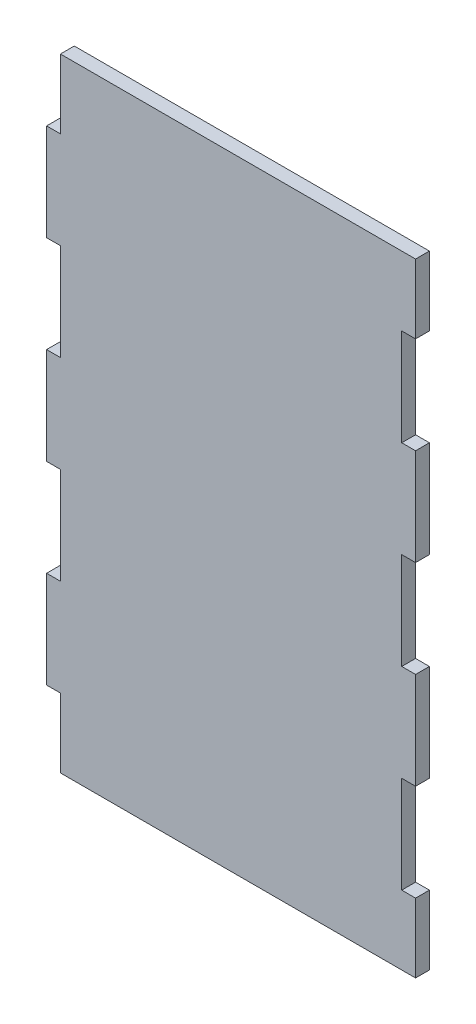
ISO-10303-21;
HEADER;
FILE_DESCRIPTION(('STEP AP214'),'2;1');
FILE_NAME('part.step','',(''),(''),'','','');
FILE_SCHEMA(('AUTOMOTIVE_DESIGN { 1 0 10303 214 1 1 1 1 }'));
ENDSEC;
DATA;
#1=APPLICATION_CONTEXT('core data for automotive mechanical design processes');
#2=APPLICATION_PROTOCOL_DEFINITION('international standard','automotive_design',2000,#1);
#3=PRODUCT_CONTEXT('',#1,'mechanical');
#4=PRODUCT('Part','Part','',(#3));
#5=PRODUCT_RELATED_PRODUCT_CATEGORY('part','',(#4));
#6=PRODUCT_DEFINITION_FORMATION('','',#4);
#7=PRODUCT_DEFINITION_CONTEXT('part definition',#1,'design');
#8=PRODUCT_DEFINITION('design','',#6,#7);
#9=PRODUCT_DEFINITION_SHAPE('','',#8);
#10=(LENGTH_UNIT() NAMED_UNIT(*) SI_UNIT(.MILLI.,.METRE.));
#11=(NAMED_UNIT(*) PLANE_ANGLE_UNIT() SI_UNIT($,.RADIAN.));
#12=(NAMED_UNIT(*) SI_UNIT($,.STERADIAN.) SOLID_ANGLE_UNIT());
#13=UNCERTAINTY_MEASURE_WITH_UNIT(LENGTH_MEASURE(1.E-05),#10,'distance_accuracy_value','');
#14=(GEOMETRIC_REPRESENTATION_CONTEXT(3) GLOBAL_UNCERTAINTY_ASSIGNED_CONTEXT((#13)) GLOBAL_UNIT_ASSIGNED_CONTEXT((#10,
#11,#12)) REPRESENTATION_CONTEXT('',''));
#15=CARTESIAN_POINT('',(0.,0.,0.));
#16=DIRECTION('',(0.,0.,1.));
#17=DIRECTION('',(1.,0.,0.));
#18=AXIS2_PLACEMENT_3D('',#15,#16,#17);
#19=CARTESIAN_POINT('',(-38.5,-67.5,3.));
#20=DIRECTION('',(1.,0.,0.));
#21=DIRECTION('',(0.,0.,-1.));
#22=AXIS2_PLACEMENT_3D('',#19,#20,#21);
#23=PLANE('',#22);
#24=DIRECTION('',(0.,-1.,0.));
#25=VECTOR('',#24,1.);
#26=CARTESIAN_POINT('',(-38.5,-67.5,3.));
#27=LINE('',#26,#25);
#28=CARTESIAN_POINT('',(-38.5,-52.5,3.));
#29=VERTEX_POINT('',#28);
#30=CARTESIAN_POINT('',(-38.5,-67.5,3.));
#31=VERTEX_POINT('',#30);
#32=EDGE_CURVE('E53',#29,#31,#27,.T.);
#33=ORIENTED_EDGE('',*,*,#32,.F.);
#34=DIRECTION('',(0.,0.,1.));
#35=VECTOR('',#34,1.);
#36=CARTESIAN_POINT('',(-38.5,-52.5,0.));
#37=LINE('',#36,#35);
#38=CARTESIAN_POINT('',(-38.5,-52.5,0.));
#39=VERTEX_POINT('',#38);
#40=EDGE_CURVE('E255',#39,#29,#37,.T.);
#41=ORIENTED_EDGE('',*,*,#40,.F.);
#42=DIRECTION('',(0.,-1.,0.));
#43=VECTOR('',#42,1.);
#44=CARTESIAN_POINT('',(-38.5,-67.5,0.));
#45=LINE('',#44,#43);
#46=CARTESIAN_POINT('',(-38.5,-67.5,0.));
#47=VERTEX_POINT('',#46);
#48=EDGE_CURVE('E334',#39,#47,#45,.T.);
#49=ORIENTED_EDGE('',*,*,#48,.T.);
#50=DIRECTION('',(0.,0.,-1.));
#51=VECTOR('',#50,1.);
#52=CARTESIAN_POINT('',(-38.5,-67.5,3.));
#53=LINE('',#52,#51);
#54=EDGE_CURVE('E11',#31,#47,#53,.T.);
#55=ORIENTED_EDGE('',*,*,#54,.F.);
#56=EDGE_LOOP('',(#33,#41,#49,#55));
#57=FACE_BOUND('',#56,.T.);
#58=ADVANCED_FACE('F38',(#57),#23,.F.);
#59=CARTESIAN_POINT('',(-38.5,-10.5,0.));
#60=VERTEX_POINT('',#59);
#61=CARTESIAN_POINT('',(-38.5,-31.5,0.));
#62=VERTEX_POINT('',#61);
#63=EDGE_CURVE('E443',#60,#62,#45,.T.);
#64=ORIENTED_EDGE('',*,*,#63,.T.);
#65=DIRECTION('',(0.,0.,1.));
#66=VECTOR('',#65,1.);
#67=CARTESIAN_POINT('',(-38.5,-31.5,0.));
#68=LINE('',#67,#66);
#69=CARTESIAN_POINT('',(-38.5,-31.5,3.));
#70=VERTEX_POINT('',#69);
#71=EDGE_CURVE('E61',#62,#70,#68,.T.);
#72=ORIENTED_EDGE('',*,*,#71,.T.);
#73=CARTESIAN_POINT('',(-38.5,-10.5,3.));
#74=VERTEX_POINT('',#73);
#75=EDGE_CURVE('E464',#74,#70,#27,.T.);
#76=ORIENTED_EDGE('',*,*,#75,.F.);
#77=DIRECTION('',(0.,0.,1.));
#78=VECTOR('',#77,1.);
#79=CARTESIAN_POINT('',(-38.5,-10.5,0.));
#80=LINE('',#79,#78);
#81=EDGE_CURVE('E278',#60,#74,#80,.T.);
#82=ORIENTED_EDGE('',*,*,#81,.F.);
#83=EDGE_LOOP('',(#64,#72,#76,#82));
#84=FACE_BOUND('',#83,.T.);
#85=ADVANCED_FACE('F465',(#84),#23,.F.);
#86=CARTESIAN_POINT('',(-38.5,31.5,0.));
#87=VERTEX_POINT('',#86);
#88=CARTESIAN_POINT('',(-38.5,10.5,0.));
#89=VERTEX_POINT('',#88);
#90=EDGE_CURVE('E408',#87,#89,#45,.T.);
#91=ORIENTED_EDGE('',*,*,#90,.T.);
#92=DIRECTION('',(0.,0.,1.));
#93=VECTOR('',#92,1.);
#94=CARTESIAN_POINT('',(-38.5,10.5,0.));
#95=LINE('',#94,#93);
#96=CARTESIAN_POINT('',(-38.5,10.5,3.));
#97=VERTEX_POINT('',#96);
#98=EDGE_CURVE('E270',#89,#97,#95,.T.);
#99=ORIENTED_EDGE('',*,*,#98,.T.);
#100=CARTESIAN_POINT('',(-38.5,31.5,3.));
#101=VERTEX_POINT('',#100);
#102=EDGE_CURVE('E394',#101,#97,#27,.T.);
#103=ORIENTED_EDGE('',*,*,#102,.F.);
#104=DIRECTION('',(0.,0.,1.));
#105=VECTOR('',#104,1.);
#106=CARTESIAN_POINT('',(-38.5,31.5,0.));
#107=LINE('',#106,#105);
#108=EDGE_CURVE('E304',#87,#101,#107,.T.);
#109=ORIENTED_EDGE('',*,*,#108,.F.);
#110=EDGE_LOOP('',(#91,#99,#103,#109));
#111=FACE_BOUND('',#110,.T.);
#112=ADVANCED_FACE('F449',(#111),#23,.F.);
#113=CARTESIAN_POINT('',(38.5,-67.5,3.));
#114=DIRECTION('',(-1.,0.,0.));
#115=DIRECTION('',(0.,0.,1.));
#116=AXIS2_PLACEMENT_3D('',#113,#114,#115);
#117=PLANE('',#116);
#118=DIRECTION('',(0.,1.,0.));
#119=VECTOR('',#118,1.);
#120=CARTESIAN_POINT('',(38.5,-67.5,0.));
#121=LINE('',#120,#119);
#122=CARTESIAN_POINT('',(38.5,10.5,0.));
#123=VERTEX_POINT('',#122);
#124=CARTESIAN_POINT('',(38.5,31.5,0.));
#125=VERTEX_POINT('',#124);
#126=EDGE_CURVE('E775',#123,#125,#121,.T.);
#127=ORIENTED_EDGE('',*,*,#126,.T.);
#128=DIRECTION('',(0.,0.,1.));
#129=VECTOR('',#128,1.);
#130=CARTESIAN_POINT('',(38.5,31.5,0.));
#131=LINE('',#130,#129);
#132=CARTESIAN_POINT('',(38.5,31.5,3.));
#133=VERTEX_POINT('',#132);
#134=EDGE_CURVE('E331',#125,#133,#131,.T.);
#135=ORIENTED_EDGE('',*,*,#134,.T.);
#136=DIRECTION('',(0.,1.,0.));
#137=VECTOR('',#136,1.);
#138=CARTESIAN_POINT('',(38.5,-67.5,3.));
#139=LINE('',#138,#137);
#140=CARTESIAN_POINT('',(38.5,10.5,3.));
#141=VERTEX_POINT('',#140);
#142=EDGE_CURVE('E788',#141,#133,#139,.T.);
#143=ORIENTED_EDGE('',*,*,#142,.F.);
#144=DIRECTION('',(0.,0.,1.));
#145=VECTOR('',#144,1.);
#146=CARTESIAN_POINT('',(38.5,10.5,0.));
#147=LINE('',#146,#145);
#148=EDGE_CURVE('E327',#123,#141,#147,.T.);
#149=ORIENTED_EDGE('',*,*,#148,.F.);
#150=EDGE_LOOP('',(#127,#135,#143,#149));
#151=FACE_BOUND('',#150,.T.);
#152=ADVANCED_FACE('F495',(#151),#117,.F.);
#153=CARTESIAN_POINT('',(38.5,52.5,3.));
#154=VERTEX_POINT('',#153);
#155=CARTESIAN_POINT('',(38.5,67.5,3.));
#156=VERTEX_POINT('',#155);
#157=EDGE_CURVE('E396',#154,#156,#139,.T.);
#158=ORIENTED_EDGE('',*,*,#157,.F.);
#159=DIRECTION('',(0.,0.,1.));
#160=VECTOR('',#159,1.);
#161=CARTESIAN_POINT('',(38.5,52.5,0.));
#162=LINE('',#161,#160);
#163=CARTESIAN_POINT('',(38.5,52.5,0.));
#164=VERTEX_POINT('',#163);
#165=EDGE_CURVE('E322',#164,#154,#162,.T.);
#166=ORIENTED_EDGE('',*,*,#165,.F.);
#167=CARTESIAN_POINT('',(38.5,67.5,0.));
#168=VERTEX_POINT('',#167);
#169=EDGE_CURVE('E410',#164,#168,#121,.T.);
#170=ORIENTED_EDGE('',*,*,#169,.T.);
#171=DIRECTION('',(0.,0.,-1.));
#172=VECTOR('',#171,1.);
#173=CARTESIAN_POINT('',(38.5,67.5,3.));
#174=LINE('',#173,#172);
#175=EDGE_CURVE('E419',#156,#168,#174,.T.);
#176=ORIENTED_EDGE('',*,*,#175,.F.);
#177=EDGE_LOOP('',(#158,#166,#170,#176));
#178=FACE_BOUND('',#177,.T.);
#179=ADVANCED_FACE('F491',(#178),#117,.F.);
#180=CARTESIAN_POINT('',(38.5,-31.5,0.));
#181=VERTEX_POINT('',#180);
#182=CARTESIAN_POINT('',(38.5,-10.5,0.));
#183=VERTEX_POINT('',#182);
#184=EDGE_CURVE('E415',#181,#183,#121,.T.);
#185=ORIENTED_EDGE('',*,*,#184,.T.);
#186=DIRECTION('',(0.,0.,1.));
#187=VECTOR('',#186,1.);
#188=CARTESIAN_POINT('',(38.5,-10.5,0.));
#189=LINE('',#188,#187);
#190=CARTESIAN_POINT('',(38.5,-10.5,3.));
#191=VERTEX_POINT('',#190);
#192=EDGE_CURVE('E360',#183,#191,#189,.T.);
#193=ORIENTED_EDGE('',*,*,#192,.T.);
#194=CARTESIAN_POINT('',(38.5,-31.5,3.));
#195=VERTEX_POINT('',#194);
#196=EDGE_CURVE('E401',#195,#191,#139,.T.);
#197=ORIENTED_EDGE('',*,*,#196,.F.);
#198=DIRECTION('',(0.,0.,1.));
#199=VECTOR('',#198,1.);
#200=CARTESIAN_POINT('',(38.5,-31.5,0.));
#201=LINE('',#200,#199);
#202=EDGE_CURVE('E355',#181,#195,#201,.T.);
#203=ORIENTED_EDGE('',*,*,#202,.F.);
#204=EDGE_LOOP('',(#185,#193,#197,#203));
#205=FACE_BOUND('',#204,.T.);
#206=ADVANCED_FACE('F485',(#205),#117,.F.);
#207=CARTESIAN_POINT('',(-38.5,67.5,0.));
#208=VERTEX_POINT('',#207);
#209=CARTESIAN_POINT('',(-38.5,52.5,0.));
#210=VERTEX_POINT('',#209);
#211=EDGE_CURVE('E404',#208,#210,#45,.T.);
#212=ORIENTED_EDGE('',*,*,#211,.T.);
#213=DIRECTION('',(0.,0.,1.));
#214=VECTOR('',#213,1.);
#215=CARTESIAN_POINT('',(-38.5,52.5,0.));
#216=LINE('',#215,#214);
#217=CARTESIAN_POINT('',(-38.5,52.5,3.));
#218=VERTEX_POINT('',#217);
#219=EDGE_CURVE('E296',#210,#218,#216,.T.);
#220=ORIENTED_EDGE('',*,*,#219,.T.);
#221=CARTESIAN_POINT('',(-38.5,67.5,3.));
#222=VERTEX_POINT('',#221);
#223=EDGE_CURVE('E390',#222,#218,#27,.T.);
#224=ORIENTED_EDGE('',*,*,#223,.F.);
#225=DIRECTION('',(0.,0.,-1.));
#226=VECTOR('',#225,1.);
#227=CARTESIAN_POINT('',(-38.5,67.5,3.));
#228=LINE('',#227,#226);
#229=EDGE_CURVE('E403',#222,#208,#228,.T.);
#230=ORIENTED_EDGE('',*,*,#229,.T.);
#231=EDGE_LOOP('',(#212,#220,#224,#230));
#232=FACE_BOUND('',#231,.T.);
#233=ADVANCED_FACE('F40',(#232),#23,.F.);
#234=CARTESIAN_POINT('',(38.5,-67.5,3.));
#235=DIRECTION('',(0.,1.,0.));
#236=DIRECTION('',(-1.,0.,0.));
#237=AXIS2_PLACEMENT_3D('',#234,#235,#236);
#238=PLANE('',#237);
#239=DIRECTION('',(1.,0.,0.));
#240=VECTOR('',#239,1.);
#241=CARTESIAN_POINT('',(38.5,-67.5,0.));
#242=LINE('',#241,#240);
#243=CARTESIAN_POINT('',(38.5,-67.5,0.));
#244=VERTEX_POINT('',#243);
#245=EDGE_CURVE('E407',#47,#244,#242,.T.);
#246=ORIENTED_EDGE('',*,*,#245,.T.);
#247=DIRECTION('',(0.,0.,-1.));
#248=VECTOR('',#247,1.);
#249=CARTESIAN_POINT('',(38.5,-67.5,3.));
#250=LINE('',#249,#248);
#251=CARTESIAN_POINT('',(38.5,-67.5,3.));
#252=VERTEX_POINT('',#251);
#253=EDGE_CURVE('E46',#252,#244,#250,.T.);
#254=ORIENTED_EDGE('',*,*,#253,.F.);
#255=DIRECTION('',(1.,0.,0.));
#256=VECTOR('',#255,1.);
#257=CARTESIAN_POINT('',(38.5,-67.5,3.));
#258=LINE('',#257,#256);
#259=EDGE_CURVE('E393',#31,#252,#258,.T.);
#260=ORIENTED_EDGE('',*,*,#259,.F.);
#261=ORIENTED_EDGE('',*,*,#54,.T.);
#262=EDGE_LOOP('',(#246,#254,#260,#261));
#263=FACE_BOUND('',#262,.T.);
#264=ADVANCED_FACE('F442',(#263),#238,.F.);
#265=CARTESIAN_POINT('',(38.5,-52.5,0.));
#266=VERTEX_POINT('',#265);
#267=EDGE_CURVE('E411',#244,#266,#121,.T.);
#268=ORIENTED_EDGE('',*,*,#267,.T.);
#269=DIRECTION('',(0.,0.,1.));
#270=VECTOR('',#269,1.);
#271=CARTESIAN_POINT('',(38.5,-52.5,0.));
#272=LINE('',#271,#270);
#273=CARTESIAN_POINT('',(38.5,-52.5,3.));
#274=VERTEX_POINT('',#273);
#275=EDGE_CURVE('E384',#266,#274,#272,.T.);
#276=ORIENTED_EDGE('',*,*,#275,.T.);
#277=EDGE_CURVE('E397',#252,#274,#139,.T.);
#278=ORIENTED_EDGE('',*,*,#277,.F.);
#279=ORIENTED_EDGE('',*,*,#253,.T.);
#280=EDGE_LOOP('',(#268,#276,#278,#279));
#281=FACE_BOUND('',#280,.T.);
#282=ADVANCED_FACE('F426',(#281),#117,.F.);
#283=CARTESIAN_POINT('',(38.5,67.5,3.));
#284=DIRECTION('',(0.,-1.,0.));
#285=DIRECTION('',(1.,0.,0.));
#286=AXIS2_PLACEMENT_3D('',#283,#284,#285);
#287=PLANE('',#286);
#288=DIRECTION('',(-1.,0.,0.));
#289=VECTOR('',#288,1.);
#290=CARTESIAN_POINT('',(38.5,67.5,0.));
#291=LINE('',#290,#289);
#292=EDGE_CURVE('E414',#168,#208,#291,.T.);
#293=ORIENTED_EDGE('',*,*,#292,.T.);
#294=ORIENTED_EDGE('',*,*,#229,.F.);
#295=DIRECTION('',(-1.,0.,0.));
#296=VECTOR('',#295,1.);
#297=CARTESIAN_POINT('',(38.5,67.5,3.));
#298=LINE('',#297,#296);
#299=EDGE_CURVE('E400',#156,#222,#298,.T.);
#300=ORIENTED_EDGE('',*,*,#299,.F.);
#301=ORIENTED_EDGE('',*,*,#175,.T.);
#302=EDGE_LOOP('',(#293,#294,#300,#301));
#303=FACE_BOUND('',#302,.T.);
#304=ADVANCED_FACE('F507',(#303),#287,.F.);
#305=CARTESIAN_POINT('',(0.,0.,3.));
#306=DIRECTION('',(0.,0.,1.));
#307=DIRECTION('',(1.,0.,0.));
#308=AXIS2_PLACEMENT_3D('',#305,#306,#307);
#309=PLANE('',#308);
#310=DIRECTION('',(1.,0.,0.));
#311=VECTOR('',#310,1.);
#312=CARTESIAN_POINT('',(38.5,31.5,3.));
#313=LINE('',#312,#311);
#314=CARTESIAN_POINT('',(35.5,31.5,3.));
#315=VERTEX_POINT('',#314);
#316=EDGE_CURVE('E317',#315,#133,#313,.T.);
#317=ORIENTED_EDGE('',*,*,#316,.F.);
#318=DIRECTION('',(0.,-1.,0.));
#319=VECTOR('',#318,1.);
#320=CARTESIAN_POINT('',(35.5,52.5,3.));
#321=LINE('',#320,#319);
#322=CARTESIAN_POINT('',(35.5,52.5,3.));
#323=VERTEX_POINT('',#322);
#324=EDGE_CURVE('E326',#323,#315,#321,.T.);
#325=ORIENTED_EDGE('',*,*,#324,.F.);
#326=DIRECTION('',(-1.,0.,0.));
#327=VECTOR('',#326,1.);
#328=CARTESIAN_POINT('',(38.5,52.5,3.));
#329=LINE('',#328,#327);
#330=EDGE_CURVE('E323',#154,#323,#329,.T.);
#331=ORIENTED_EDGE('',*,*,#330,.F.);
#332=ORIENTED_EDGE('',*,*,#157,.T.);
#333=ORIENTED_EDGE('',*,*,#299,.T.);
#334=ORIENTED_EDGE('',*,*,#223,.T.);
#335=DIRECTION('',(-1.,0.,0.));
#336=VECTOR('',#335,1.);
#337=CARTESIAN_POINT('',(-38.5,52.5,3.));
#338=LINE('',#337,#336);
#339=CARTESIAN_POINT('',(-41.5,52.5,3.));
#340=VERTEX_POINT('',#339);
#341=EDGE_CURVE('E281',#218,#340,#338,.T.);
#342=ORIENTED_EDGE('',*,*,#341,.T.);
#343=DIRECTION('',(0.,-1.,0.));
#344=VECTOR('',#343,1.);
#345=CARTESIAN_POINT('',(-41.5,52.5,3.));
#346=LINE('',#345,#344);
#347=CARTESIAN_POINT('',(-41.5,31.5,3.));
#348=VERTEX_POINT('',#347);
#349=EDGE_CURVE('E299',#340,#348,#346,.T.);
#350=ORIENTED_EDGE('',*,*,#349,.T.);
#351=DIRECTION('',(1.,0.,0.));
#352=VECTOR('',#351,1.);
#353=CARTESIAN_POINT('',(-38.5,31.5,3.));
#354=LINE('',#353,#352);
#355=EDGE_CURVE('E291',#348,#101,#354,.T.);
#356=ORIENTED_EDGE('',*,*,#355,.T.);
#357=ORIENTED_EDGE('',*,*,#102,.T.);
#358=DIRECTION('',(-1.,0.,0.));
#359=VECTOR('',#358,1.);
#360=CARTESIAN_POINT('',(-38.5,10.5,3.));
#361=LINE('',#360,#359);
#362=CARTESIAN_POINT('',(-41.5,10.5,3.));
#363=VERTEX_POINT('',#362);
#364=EDGE_CURVE('E257',#97,#363,#361,.T.);
#365=ORIENTED_EDGE('',*,*,#364,.T.);
#366=DIRECTION('',(0.,-1.,0.));
#367=VECTOR('',#366,1.);
#368=CARTESIAN_POINT('',(-41.5,10.5,3.));
#369=LINE('',#368,#367);
#370=CARTESIAN_POINT('',(-41.5,-10.5,3.));
#371=VERTEX_POINT('',#370);
#372=EDGE_CURVE('E273',#363,#371,#369,.T.);
#373=ORIENTED_EDGE('',*,*,#372,.T.);
#374=DIRECTION('',(1.,0.,0.));
#375=VECTOR('',#374,1.);
#376=CARTESIAN_POINT('',(-38.5,-10.5,3.));
#377=LINE('',#376,#375);
#378=EDGE_CURVE('E264',#371,#74,#377,.T.);
#379=ORIENTED_EDGE('',*,*,#378,.T.);
#380=ORIENTED_EDGE('',*,*,#75,.T.);
#381=DIRECTION('',(-1.,0.,0.));
#382=VECTOR('',#381,1.);
#383=CARTESIAN_POINT('',(-38.5,-31.5,3.));
#384=LINE('',#383,#382);
#385=CARTESIAN_POINT('',(-41.5,-31.5,3.));
#386=VERTEX_POINT('',#385);
#387=EDGE_CURVE('E252',#70,#386,#384,.T.);
#388=ORIENTED_EDGE('',*,*,#387,.T.);
#389=DIRECTION('',(0.,-1.,0.));
#390=VECTOR('',#389,1.);
#391=CARTESIAN_POINT('',(-41.5,-31.5,3.));
#392=LINE('',#391,#390);
#393=CARTESIAN_POINT('',(-41.5,-52.5,3.));
#394=VERTEX_POINT('',#393);
#395=EDGE_CURVE('E230',#386,#394,#392,.T.);
#396=ORIENTED_EDGE('',*,*,#395,.T.);
#397=DIRECTION('',(1.,0.,0.));
#398=VECTOR('',#397,1.);
#399=CARTESIAN_POINT('',(-38.5,-52.5,3.));
#400=LINE('',#399,#398);
#401=EDGE_CURVE('E246',#394,#29,#400,.T.);
#402=ORIENTED_EDGE('',*,*,#401,.T.);
#403=ORIENTED_EDGE('',*,*,#32,.T.);
#404=ORIENTED_EDGE('',*,*,#259,.T.);
#405=ORIENTED_EDGE('',*,*,#277,.T.);
#406=DIRECTION('',(1.,0.,0.));
#407=VECTOR('',#406,1.);
#408=CARTESIAN_POINT('',(38.5,-52.5,3.));
#409=LINE('',#408,#407);
#410=CARTESIAN_POINT('',(35.5,-52.5,3.));
#411=VERTEX_POINT('',#410);
#412=EDGE_CURVE('E370',#411,#274,#409,.T.);
#413=ORIENTED_EDGE('',*,*,#412,.F.);
#414=DIRECTION('',(0.,-1.,0.));
#415=VECTOR('',#414,1.);
#416=CARTESIAN_POINT('',(35.5,-31.5,3.));
#417=LINE('',#416,#415);
#418=CARTESIAN_POINT('',(35.5,-31.5,3.));
#419=VERTEX_POINT('',#418);
#420=EDGE_CURVE('E379',#419,#411,#417,.T.);
#421=ORIENTED_EDGE('',*,*,#420,.F.);
#422=DIRECTION('',(-1.,0.,0.));
#423=VECTOR('',#422,1.);
#424=CARTESIAN_POINT('',(38.5,-31.5,3.));
#425=LINE('',#424,#423);
#426=EDGE_CURVE('E306',#195,#419,#425,.T.);
#427=ORIENTED_EDGE('',*,*,#426,.F.);
#428=ORIENTED_EDGE('',*,*,#196,.T.);
#429=DIRECTION('',(1.,0.,0.));
#430=VECTOR('',#429,1.);
#431=CARTESIAN_POINT('',(38.5,-10.5,3.));
#432=LINE('',#431,#430);
#433=CARTESIAN_POINT('',(35.5,-10.5,3.));
#434=VERTEX_POINT('',#433);
#435=EDGE_CURVE('E344',#434,#191,#432,.T.);
#436=ORIENTED_EDGE('',*,*,#435,.F.);
#437=DIRECTION('',(0.,-1.,0.));
#438=VECTOR('',#437,1.);
#439=CARTESIAN_POINT('',(35.5,10.5,3.));
#440=LINE('',#439,#438);
#441=CARTESIAN_POINT('',(35.5,10.5,3.));
#442=VERTEX_POINT('',#441);
#443=EDGE_CURVE('E354',#442,#434,#440,.T.);
#444=ORIENTED_EDGE('',*,*,#443,.F.);
#445=DIRECTION('',(-1.,0.,0.));
#446=VECTOR('',#445,1.);
#447=CARTESIAN_POINT('',(38.5,10.5,3.));
#448=LINE('',#447,#446);
#449=EDGE_CURVE('E351',#141,#442,#448,.T.);
#450=ORIENTED_EDGE('',*,*,#449,.F.);
#451=ORIENTED_EDGE('',*,*,#142,.T.);
#452=EDGE_LOOP('',(#317,#325,#331,#332,#333,#334,#342,#350,#356,#357,#365,#373,#379,#380,#388,
#396,#402,#403,#404,#405,#413,#421,#427,#428,#436,#444,#450,#451));
#453=FACE_BOUND('',#452,.T.);
#454=ADVANCED_FACE('F441',(#453),#309,.T.);
#455=CARTESIAN_POINT('',(0.,0.,0.));
#456=DIRECTION('',(0.,0.,1.));
#457=DIRECTION('',(1.,0.,0.));
#458=AXIS2_PLACEMENT_3D('',#455,#456,#457);
#459=PLANE('',#458);
#460=DIRECTION('',(0.,-1.,0.));
#461=VECTOR('',#460,1.);
#462=CARTESIAN_POINT('',(35.5,52.5,0.));
#463=LINE('',#462,#461);
#464=CARTESIAN_POINT('',(35.5,52.5,0.));
#465=VERTEX_POINT('',#464);
#466=CARTESIAN_POINT('',(35.5,31.5,0.));
#467=VERTEX_POINT('',#466);
#468=EDGE_CURVE('E316',#465,#467,#463,.T.);
#469=ORIENTED_EDGE('',*,*,#468,.T.);
#470=DIRECTION('',(1.,0.,0.));
#471=VECTOR('',#470,1.);
#472=CARTESIAN_POINT('',(38.5,31.5,0.));
#473=LINE('',#472,#471);
#474=EDGE_CURVE('E319',#467,#125,#473,.T.);
#475=ORIENTED_EDGE('',*,*,#474,.T.);
#476=ORIENTED_EDGE('',*,*,#126,.F.);
#477=DIRECTION('',(-1.,0.,0.));
#478=VECTOR('',#477,1.);
#479=CARTESIAN_POINT('',(38.5,10.5,0.));
#480=LINE('',#479,#478);
#481=CARTESIAN_POINT('',(35.5,10.5,0.));
#482=VERTEX_POINT('',#481);
#483=EDGE_CURVE('E340',#123,#482,#480,.T.);
#484=ORIENTED_EDGE('',*,*,#483,.T.);
#485=DIRECTION('',(0.,-1.,0.));
#486=VECTOR('',#485,1.);
#487=CARTESIAN_POINT('',(35.5,10.5,0.));
#488=LINE('',#487,#486);
#489=CARTESIAN_POINT('',(35.5,-10.5,0.));
#490=VERTEX_POINT('',#489);
#491=EDGE_CURVE('E343',#482,#490,#488,.T.);
#492=ORIENTED_EDGE('',*,*,#491,.T.);
#493=DIRECTION('',(1.,0.,0.));
#494=VECTOR('',#493,1.);
#495=CARTESIAN_POINT('',(38.5,-10.5,0.));
#496=LINE('',#495,#494);
#497=EDGE_CURVE('E347',#490,#183,#496,.T.);
#498=ORIENTED_EDGE('',*,*,#497,.T.);
#499=ORIENTED_EDGE('',*,*,#184,.F.);
#500=DIRECTION('',(-1.,0.,0.));
#501=VECTOR('',#500,1.);
#502=CARTESIAN_POINT('',(38.5,-31.5,0.));
#503=LINE('',#502,#501);
#504=CARTESIAN_POINT('',(35.5,-31.5,0.));
#505=VERTEX_POINT('',#504);
#506=EDGE_CURVE('E366',#181,#505,#503,.T.);
#507=ORIENTED_EDGE('',*,*,#506,.T.);
#508=DIRECTION('',(0.,-1.,0.));
#509=VECTOR('',#508,1.);
#510=CARTESIAN_POINT('',(35.5,-31.5,0.));
#511=LINE('',#510,#509);
#512=CARTESIAN_POINT('',(35.5,-52.5,0.));
#513=VERTEX_POINT('',#512);
#514=EDGE_CURVE('E369',#505,#513,#511,.T.);
#515=ORIENTED_EDGE('',*,*,#514,.T.);
#516=DIRECTION('',(1.,0.,0.));
#517=VECTOR('',#516,1.);
#518=CARTESIAN_POINT('',(38.5,-52.5,0.));
#519=LINE('',#518,#517);
#520=EDGE_CURVE('E373',#513,#266,#519,.T.);
#521=ORIENTED_EDGE('',*,*,#520,.T.);
#522=ORIENTED_EDGE('',*,*,#267,.F.);
#523=ORIENTED_EDGE('',*,*,#245,.F.);
#524=ORIENTED_EDGE('',*,*,#48,.F.);
#525=DIRECTION('',(1.,0.,0.));
#526=VECTOR('',#525,1.);
#527=CARTESIAN_POINT('',(-38.5,-52.5,0.));
#528=LINE('',#527,#526);
#529=CARTESIAN_POINT('',(-41.5,-52.5,0.));
#530=VERTEX_POINT('',#529);
#531=EDGE_CURVE('E243',#530,#39,#528,.T.);
#532=ORIENTED_EDGE('',*,*,#531,.F.);
#533=DIRECTION('',(0.,-1.,0.));
#534=VECTOR('',#533,1.);
#535=CARTESIAN_POINT('',(-41.5,-31.5,0.));
#536=LINE('',#535,#534);
#537=CARTESIAN_POINT('',(-41.5,-31.5,0.));
#538=VERTEX_POINT('',#537);
#539=EDGE_CURVE('E227',#538,#530,#536,.T.);
#540=ORIENTED_EDGE('',*,*,#539,.F.);
#541=DIRECTION('',(-1.,0.,0.));
#542=VECTOR('',#541,1.);
#543=CARTESIAN_POINT('',(-38.5,-31.5,0.));
#544=LINE('',#543,#542);
#545=EDGE_CURVE('E241',#62,#538,#544,.T.);
#546=ORIENTED_EDGE('',*,*,#545,.F.);
#547=ORIENTED_EDGE('',*,*,#63,.F.);
#548=DIRECTION('',(1.,0.,0.));
#549=VECTOR('',#548,1.);
#550=CARTESIAN_POINT('',(-38.5,-10.5,0.));
#551=LINE('',#550,#549);
#552=CARTESIAN_POINT('',(-41.5,-10.5,0.));
#553=VERTEX_POINT('',#552);
#554=EDGE_CURVE('E267',#553,#60,#551,.T.);
#555=ORIENTED_EDGE('',*,*,#554,.F.);
#556=DIRECTION('',(0.,-1.,0.));
#557=VECTOR('',#556,1.);
#558=CARTESIAN_POINT('',(-41.5,10.5,0.));
#559=LINE('',#558,#557);
#560=CARTESIAN_POINT('',(-41.5,10.5,0.));
#561=VERTEX_POINT('',#560);
#562=EDGE_CURVE('E263',#561,#553,#559,.T.);
#563=ORIENTED_EDGE('',*,*,#562,.F.);
#564=DIRECTION('',(-1.,0.,0.));
#565=VECTOR('',#564,1.);
#566=CARTESIAN_POINT('',(-38.5,10.5,0.));
#567=LINE('',#566,#565);
#568=EDGE_CURVE('E260',#89,#561,#567,.T.);
#569=ORIENTED_EDGE('',*,*,#568,.F.);
#570=ORIENTED_EDGE('',*,*,#90,.F.);
#571=DIRECTION('',(1.,0.,0.));
#572=VECTOR('',#571,1.);
#573=CARTESIAN_POINT('',(-38.5,31.5,0.));
#574=LINE('',#573,#572);
#575=CARTESIAN_POINT('',(-41.5,31.5,0.));
#576=VERTEX_POINT('',#575);
#577=EDGE_CURVE('E294',#576,#87,#574,.T.);
#578=ORIENTED_EDGE('',*,*,#577,.F.);
#579=DIRECTION('',(0.,-1.,0.));
#580=VECTOR('',#579,1.);
#581=CARTESIAN_POINT('',(-41.5,52.5,0.));
#582=LINE('',#581,#580);
#583=CARTESIAN_POINT('',(-41.5,52.5,0.));
#584=VERTEX_POINT('',#583);
#585=EDGE_CURVE('E290',#584,#576,#582,.T.);
#586=ORIENTED_EDGE('',*,*,#585,.F.);
#587=DIRECTION('',(-1.,0.,0.));
#588=VECTOR('',#587,1.);
#589=CARTESIAN_POINT('',(-38.5,52.5,0.));
#590=LINE('',#589,#588);
#591=EDGE_CURVE('E287',#210,#584,#590,.T.);
#592=ORIENTED_EDGE('',*,*,#591,.F.);
#593=ORIENTED_EDGE('',*,*,#211,.F.);
#594=ORIENTED_EDGE('',*,*,#292,.F.);
#595=ORIENTED_EDGE('',*,*,#169,.F.);
#596=DIRECTION('',(-1.,0.,0.));
#597=VECTOR('',#596,1.);
#598=CARTESIAN_POINT('',(38.5,52.5,0.));
#599=LINE('',#598,#597);
#600=EDGE_CURVE('E313',#164,#465,#599,.T.);
#601=ORIENTED_EDGE('',*,*,#600,.T.);
#602=EDGE_LOOP('',(#469,#475,#476,#484,#492,#498,#499,#507,#515,#521,#522,#523,#524,#532,#540,
#546,#547,#555,#563,#569,#570,#578,#586,#592,#593,#594,#595,#601));
#603=FACE_BOUND('',#602,.T.);
#604=ADVANCED_FACE('F240',(#603),#459,.F.);
#605=CARTESIAN_POINT('',(38.5,-31.5,0.));
#606=DIRECTION('',(0.,1.,0.));
#607=DIRECTION('',(0.,0.,1.));
#608=AXIS2_PLACEMENT_3D('',#605,#606,#607);
#609=PLANE('',#608);
#610=ORIENTED_EDGE('',*,*,#426,.T.);
#611=DIRECTION('',(0.,0.,1.));
#612=VECTOR('',#611,1.);
#613=CARTESIAN_POINT('',(35.5,-31.5,0.));
#614=LINE('',#613,#612);
#615=EDGE_CURVE('E376',#505,#419,#614,.T.);
#616=ORIENTED_EDGE('',*,*,#615,.F.);
#617=ORIENTED_EDGE('',*,*,#506,.F.);
#618=ORIENTED_EDGE('',*,*,#202,.T.);
#619=EDGE_LOOP('',(#610,#616,#617,#618));
#620=FACE_BOUND('',#619,.T.);
#621=ADVANCED_FACE('F518',(#620),#609,.F.);
#622=CARTESIAN_POINT('',(38.5,-52.5,0.));
#623=DIRECTION('',(0.,-1.,0.));
#624=DIRECTION('',(0.,0.,-1.));
#625=AXIS2_PLACEMENT_3D('',#622,#623,#624);
#626=PLANE('',#625);
#627=ORIENTED_EDGE('',*,*,#412,.T.);
#628=ORIENTED_EDGE('',*,*,#275,.F.);
#629=ORIENTED_EDGE('',*,*,#520,.F.);
#630=DIRECTION('',(0.,0.,1.));
#631=VECTOR('',#630,1.);
#632=CARTESIAN_POINT('',(35.5,-52.5,0.));
#633=LINE('',#632,#631);
#634=EDGE_CURVE('E387',#513,#411,#633,.T.);
#635=ORIENTED_EDGE('',*,*,#634,.T.);
#636=EDGE_LOOP('',(#627,#628,#629,#635));
#637=FACE_BOUND('',#636,.T.);
#638=ADVANCED_FACE('F433',(#637),#626,.F.);
#639=CARTESIAN_POINT('',(35.5,-31.5,0.));
#640=DIRECTION('',(-1.,0.,0.));
#641=DIRECTION('',(0.,-1.,0.));
#642=AXIS2_PLACEMENT_3D('',#639,#640,#641);
#643=PLANE('',#642);
#644=ORIENTED_EDGE('',*,*,#420,.T.);
#645=ORIENTED_EDGE('',*,*,#634,.F.);
#646=ORIENTED_EDGE('',*,*,#514,.F.);
#647=ORIENTED_EDGE('',*,*,#615,.T.);
#648=EDGE_LOOP('',(#644,#645,#646,#647));
#649=FACE_BOUND('',#648,.T.);
#650=ADVANCED_FACE('F435',(#649),#643,.F.);
#651=CARTESIAN_POINT('',(38.5,10.5,0.));
#652=DIRECTION('',(0.,1.,0.));
#653=DIRECTION('',(0.,0.,1.));
#654=AXIS2_PLACEMENT_3D('',#651,#652,#653);
#655=PLANE('',#654);
#656=ORIENTED_EDGE('',*,*,#449,.T.);
#657=DIRECTION('',(0.,0.,1.));
#658=VECTOR('',#657,1.);
#659=CARTESIAN_POINT('',(35.5,10.5,0.));
#660=LINE('',#659,#658);
#661=EDGE_CURVE('E350',#482,#442,#660,.T.);
#662=ORIENTED_EDGE('',*,*,#661,.F.);
#663=ORIENTED_EDGE('',*,*,#483,.F.);
#664=ORIENTED_EDGE('',*,*,#148,.T.);
#665=EDGE_LOOP('',(#656,#662,#663,#664));
#666=FACE_BOUND('',#665,.T.);
#667=ADVANCED_FACE('F525',(#666),#655,.F.);
#668=CARTESIAN_POINT('',(38.5,-10.5,0.));
#669=DIRECTION('',(0.,-1.,0.));
#670=DIRECTION('',(0.,0.,-1.));
#671=AXIS2_PLACEMENT_3D('',#668,#669,#670);
#672=PLANE('',#671);
#673=ORIENTED_EDGE('',*,*,#435,.T.);
#674=ORIENTED_EDGE('',*,*,#192,.F.);
#675=ORIENTED_EDGE('',*,*,#497,.F.);
#676=DIRECTION('',(0.,0.,1.));
#677=VECTOR('',#676,1.);
#678=CARTESIAN_POINT('',(35.5,-10.5,0.));
#679=LINE('',#678,#677);
#680=EDGE_CURVE('E363',#490,#434,#679,.T.);
#681=ORIENTED_EDGE('',*,*,#680,.T.);
#682=EDGE_LOOP('',(#673,#674,#675,#681));
#683=FACE_BOUND('',#682,.T.);
#684=ADVANCED_FACE('F530',(#683),#672,.F.);
#685=CARTESIAN_POINT('',(35.5,10.5,0.));
#686=DIRECTION('',(-1.,0.,0.));
#687=DIRECTION('',(0.,-1.,0.));
#688=AXIS2_PLACEMENT_3D('',#685,#686,#687);
#689=PLANE('',#688);
#690=ORIENTED_EDGE('',*,*,#443,.T.);
#691=ORIENTED_EDGE('',*,*,#680,.F.);
#692=ORIENTED_EDGE('',*,*,#491,.F.);
#693=ORIENTED_EDGE('',*,*,#661,.T.);
#694=EDGE_LOOP('',(#690,#691,#692,#693));
#695=FACE_BOUND('',#694,.T.);
#696=ADVANCED_FACE('F532',(#695),#689,.F.);
#697=CARTESIAN_POINT('',(38.5,31.5,0.));
#698=DIRECTION('',(0.,-1.,0.));
#699=DIRECTION('',(0.,0.,-1.));
#700=AXIS2_PLACEMENT_3D('',#697,#698,#699);
#701=PLANE('',#700);
#702=ORIENTED_EDGE('',*,*,#316,.T.);
#703=ORIENTED_EDGE('',*,*,#134,.F.);
#704=ORIENTED_EDGE('',*,*,#474,.F.);
#705=DIRECTION('',(0.,0.,1.));
#706=VECTOR('',#705,1.);
#707=CARTESIAN_POINT('',(35.5,31.5,0.));
#708=LINE('',#707,#706);
#709=EDGE_CURVE('E335',#467,#315,#708,.T.);
#710=ORIENTED_EDGE('',*,*,#709,.T.);
#711=EDGE_LOOP('',(#702,#703,#704,#710));
#712=FACE_BOUND('',#711,.T.);
#713=ADVANCED_FACE('F535',(#712),#701,.F.);
#714=CARTESIAN_POINT('',(35.5,52.5,0.));
#715=DIRECTION('',(-1.,0.,0.));
#716=DIRECTION('',(0.,-1.,0.));
#717=AXIS2_PLACEMENT_3D('',#714,#715,#716);
#718=PLANE('',#717);
#719=ORIENTED_EDGE('',*,*,#324,.T.);
#720=ORIENTED_EDGE('',*,*,#709,.F.);
#721=ORIENTED_EDGE('',*,*,#468,.F.);
#722=DIRECTION('',(0.,0.,1.));
#723=VECTOR('',#722,1.);
#724=CARTESIAN_POINT('',(35.5,52.5,0.));
#725=LINE('',#724,#723);
#726=EDGE_CURVE('E337',#465,#323,#725,.T.);
#727=ORIENTED_EDGE('',*,*,#726,.T.);
#728=EDGE_LOOP('',(#719,#720,#721,#727));
#729=FACE_BOUND('',#728,.T.);
#730=ADVANCED_FACE('F544',(#729),#718,.F.);
#731=CARTESIAN_POINT('',(38.5,52.5,0.));
#732=DIRECTION('',(0.,1.,0.));
#733=DIRECTION('',(0.,0.,1.));
#734=AXIS2_PLACEMENT_3D('',#731,#732,#733);
#735=PLANE('',#734);
#736=ORIENTED_EDGE('',*,*,#330,.T.);
#737=ORIENTED_EDGE('',*,*,#726,.F.);
#738=ORIENTED_EDGE('',*,*,#600,.F.);
#739=ORIENTED_EDGE('',*,*,#165,.T.);
#740=EDGE_LOOP('',(#736,#737,#738,#739));
#741=FACE_BOUND('',#740,.T.);
#742=ADVANCED_FACE('F540',(#741),#735,.F.);
#743=CARTESIAN_POINT('',(-38.5,31.5,0.));
#744=DIRECTION('',(0.,-1.,0.));
#745=DIRECTION('',(0.,0.,-1.));
#746=AXIS2_PLACEMENT_3D('',#743,#744,#745);
#747=PLANE('',#746);
#748=ORIENTED_EDGE('',*,*,#355,.F.);
#749=DIRECTION('',(0.,0.,1.));
#750=VECTOR('',#749,1.);
#751=CARTESIAN_POINT('',(-41.5,31.5,0.));
#752=LINE('',#751,#750);
#753=EDGE_CURVE('E307',#576,#348,#752,.T.);
#754=ORIENTED_EDGE('',*,*,#753,.F.);
#755=ORIENTED_EDGE('',*,*,#577,.T.);
#756=ORIENTED_EDGE('',*,*,#108,.T.);
#757=EDGE_LOOP('',(#748,#754,#755,#756));
#758=FACE_BOUND('',#757,.T.);
#759=ADVANCED_FACE('F543',(#758),#747,.T.);
#760=CARTESIAN_POINT('',(-41.5,52.5,0.));
#761=DIRECTION('',(-1.,0.,0.));
#762=DIRECTION('',(0.,0.,1.));
#763=AXIS2_PLACEMENT_3D('',#760,#761,#762);
#764=PLANE('',#763);
#765=ORIENTED_EDGE('',*,*,#349,.F.);
#766=DIRECTION('',(0.,0.,1.));
#767=VECTOR('',#766,1.);
#768=CARTESIAN_POINT('',(-41.5,52.5,0.));
#769=LINE('',#768,#767);
#770=EDGE_CURVE('E309',#584,#340,#769,.T.);
#771=ORIENTED_EDGE('',*,*,#770,.F.);
#772=ORIENTED_EDGE('',*,*,#585,.T.);
#773=ORIENTED_EDGE('',*,*,#753,.T.);
#774=EDGE_LOOP('',(#765,#771,#772,#773));
#775=FACE_BOUND('',#774,.T.);
#776=ADVANCED_FACE('F476',(#775),#764,.T.);
#777=CARTESIAN_POINT('',(-38.5,52.5,0.));
#778=DIRECTION('',(0.,1.,0.));
#779=DIRECTION('',(0.,0.,1.));
#780=AXIS2_PLACEMENT_3D('',#777,#778,#779);
#781=PLANE('',#780);
#782=ORIENTED_EDGE('',*,*,#341,.F.);
#783=ORIENTED_EDGE('',*,*,#219,.F.);
#784=ORIENTED_EDGE('',*,*,#591,.T.);
#785=ORIENTED_EDGE('',*,*,#770,.T.);
#786=EDGE_LOOP('',(#782,#783,#784,#785));
#787=FACE_BOUND('',#786,.T.);
#788=ADVANCED_FACE('F469',(#787),#781,.T.);
#789=CARTESIAN_POINT('',(-38.5,-10.5,0.));
#790=DIRECTION('',(0.,-1.,0.));
#791=DIRECTION('',(0.,0.,-1.));
#792=AXIS2_PLACEMENT_3D('',#789,#790,#791);
#793=PLANE('',#792);
#794=ORIENTED_EDGE('',*,*,#378,.F.);
#795=DIRECTION('',(0.,0.,1.));
#796=VECTOR('',#795,1.);
#797=CARTESIAN_POINT('',(-41.5,-10.5,0.));
#798=LINE('',#797,#796);
#799=EDGE_CURVE('E282',#553,#371,#798,.T.);
#800=ORIENTED_EDGE('',*,*,#799,.F.);
#801=ORIENTED_EDGE('',*,*,#554,.T.);
#802=ORIENTED_EDGE('',*,*,#81,.T.);
#803=EDGE_LOOP('',(#794,#800,#801,#802));
#804=FACE_BOUND('',#803,.T.);
#805=ADVANCED_FACE('F467',(#804),#793,.T.);
#806=CARTESIAN_POINT('',(-41.5,10.5,0.));
#807=DIRECTION('',(-1.,0.,0.));
#808=DIRECTION('',(0.,0.,1.));
#809=AXIS2_PLACEMENT_3D('',#806,#807,#808);
#810=PLANE('',#809);
#811=ORIENTED_EDGE('',*,*,#372,.F.);
#812=DIRECTION('',(0.,0.,1.));
#813=VECTOR('',#812,1.);
#814=CARTESIAN_POINT('',(-41.5,10.5,0.));
#815=LINE('',#814,#813);
#816=EDGE_CURVE('E284',#561,#363,#815,.T.);
#817=ORIENTED_EDGE('',*,*,#816,.F.);
#818=ORIENTED_EDGE('',*,*,#562,.T.);
#819=ORIENTED_EDGE('',*,*,#799,.T.);
#820=EDGE_LOOP('',(#811,#817,#818,#819));
#821=FACE_BOUND('',#820,.T.);
#822=ADVANCED_FACE('F461',(#821),#810,.T.);
#823=CARTESIAN_POINT('',(-38.5,10.5,0.));
#824=DIRECTION('',(0.,1.,0.));
#825=DIRECTION('',(0.,0.,1.));
#826=AXIS2_PLACEMENT_3D('',#823,#824,#825);
#827=PLANE('',#826);
#828=ORIENTED_EDGE('',*,*,#364,.F.);
#829=ORIENTED_EDGE('',*,*,#98,.F.);
#830=ORIENTED_EDGE('',*,*,#568,.T.);
#831=ORIENTED_EDGE('',*,*,#816,.T.);
#832=EDGE_LOOP('',(#828,#829,#830,#831));
#833=FACE_BOUND('',#832,.T.);
#834=ADVANCED_FACE('F456',(#833),#827,.T.);
#835=CARTESIAN_POINT('',(-38.5,-52.5,0.));
#836=DIRECTION('',(0.,-1.,0.));
#837=DIRECTION('',(0.,0.,-1.));
#838=AXIS2_PLACEMENT_3D('',#835,#836,#837);
#839=PLANE('',#838);
#840=ORIENTED_EDGE('',*,*,#401,.F.);
#841=DIRECTION('',(0.,0.,1.));
#842=VECTOR('',#841,1.);
#843=CARTESIAN_POINT('',(-41.5,-52.5,0.));
#844=LINE('',#843,#842);
#845=EDGE_CURVE('E235',#530,#394,#844,.T.);
#846=ORIENTED_EDGE('',*,*,#845,.F.);
#847=ORIENTED_EDGE('',*,*,#531,.T.);
#848=ORIENTED_EDGE('',*,*,#40,.T.);
#849=EDGE_LOOP('',(#840,#846,#847,#848));
#850=FACE_BOUND('',#849,.T.);
#851=ADVANCED_FACE('F559',(#850),#839,.T.);
#852=CARTESIAN_POINT('',(-41.5,-31.5,0.));
#853=DIRECTION('',(-1.,0.,0.));
#854=DIRECTION('',(0.,0.,1.));
#855=AXIS2_PLACEMENT_3D('',#852,#853,#854);
#856=PLANE('',#855);
#857=ORIENTED_EDGE('',*,*,#395,.F.);
#858=DIRECTION('',(0.,0.,1.));
#859=VECTOR('',#858,1.);
#860=CARTESIAN_POINT('',(-41.5,-31.5,0.));
#861=LINE('',#860,#859);
#862=EDGE_CURVE('E224',#538,#386,#861,.T.);
#863=ORIENTED_EDGE('',*,*,#862,.F.);
#864=ORIENTED_EDGE('',*,*,#539,.T.);
#865=ORIENTED_EDGE('',*,*,#845,.T.);
#866=EDGE_LOOP('',(#857,#863,#864,#865));
#867=FACE_BOUND('',#866,.T.);
#868=ADVANCED_FACE('F226',(#867),#856,.T.);
#869=CARTESIAN_POINT('',(-38.5,-31.5,0.));
#870=DIRECTION('',(0.,1.,0.));
#871=DIRECTION('',(0.,0.,1.));
#872=AXIS2_PLACEMENT_3D('',#869,#870,#871);
#873=PLANE('',#872);
#874=ORIENTED_EDGE('',*,*,#387,.F.);
#875=ORIENTED_EDGE('',*,*,#71,.F.);
#876=ORIENTED_EDGE('',*,*,#545,.T.);
#877=ORIENTED_EDGE('',*,*,#862,.T.);
#878=EDGE_LOOP('',(#874,#875,#876,#877));
#879=FACE_BOUND('',#878,.T.);
#880=ADVANCED_FACE('F245',(#879),#873,.T.);
#881=CLOSED_SHELL('',(#58,#85,#112,#152,#179,#206,#233,#264,#282,#304,#454,#604,#621,#638,#650,
#667,#684,#696,#713,#730,#742,#759,#776,#788,#805,#822,#834,#851,#868,#880));
#882=MANIFOLD_SOLID_BREP('B2',#881);
#883=ADVANCED_BREP_SHAPE_REPRESENTATION('',(#18,#882),#14);
#884=SHAPE_DEFINITION_REPRESENTATION(#9,#883);
ENDSEC;
END-ISO-10303-21;
